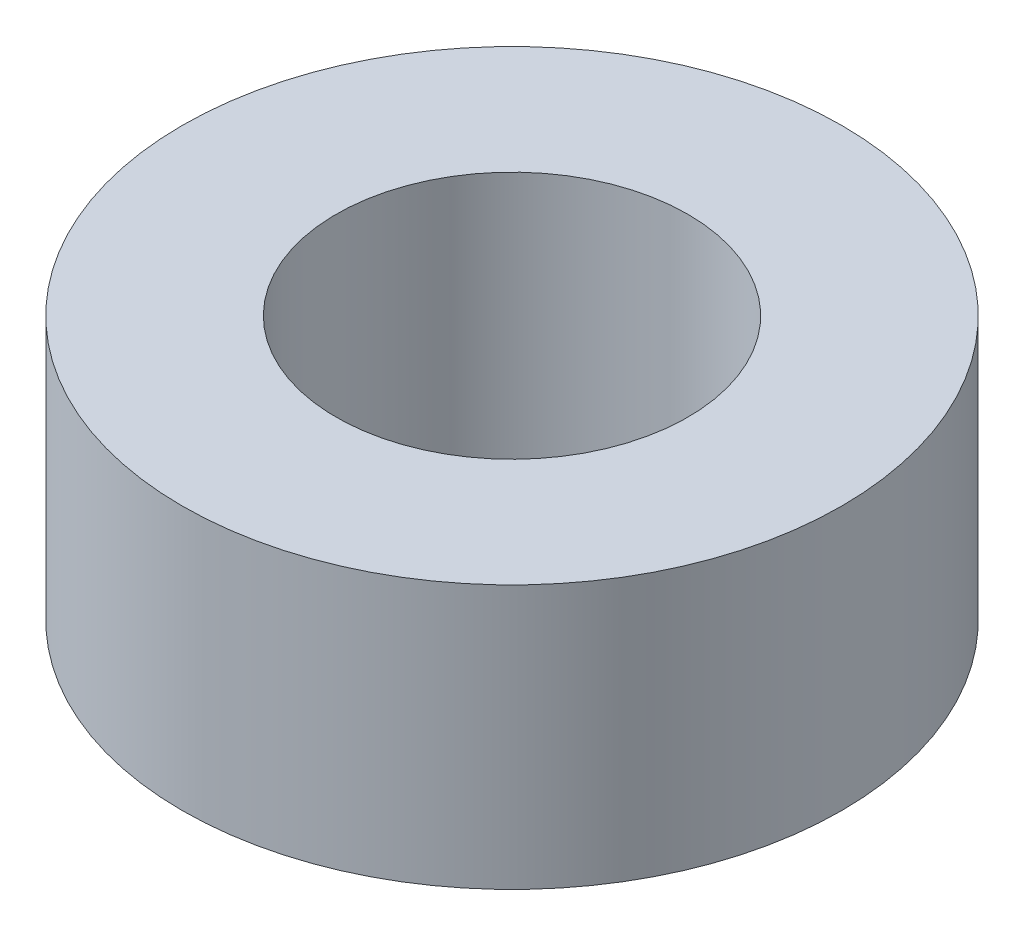
ISO-10303-21;
HEADER;
FILE_DESCRIPTION(('STEP AP214'),'2;1');
FILE_NAME('part.step','',(''),(''),'','','');
FILE_SCHEMA(('AUTOMOTIVE_DESIGN { 1 0 10303 214 1 1 1 1 }'));
ENDSEC;
DATA;
#1=APPLICATION_CONTEXT('core data for automotive mechanical design processes');
#2=APPLICATION_PROTOCOL_DEFINITION('international standard','automotive_design',2000,#1);
#3=PRODUCT_CONTEXT('',#1,'mechanical');
#4=PRODUCT('Part','Part','',(#3));
#5=PRODUCT_RELATED_PRODUCT_CATEGORY('part','',(#4));
#6=PRODUCT_DEFINITION_FORMATION('','',#4);
#7=PRODUCT_DEFINITION_CONTEXT('part definition',#1,'design');
#8=PRODUCT_DEFINITION('design','',#6,#7);
#9=PRODUCT_DEFINITION_SHAPE('','',#8);
#10=(LENGTH_UNIT() NAMED_UNIT(*) SI_UNIT(.MILLI.,.METRE.));
#11=(NAMED_UNIT(*) PLANE_ANGLE_UNIT() SI_UNIT($,.RADIAN.));
#12=(NAMED_UNIT(*) SI_UNIT($,.STERADIAN.) SOLID_ANGLE_UNIT());
#13=UNCERTAINTY_MEASURE_WITH_UNIT(LENGTH_MEASURE(1.E-05),#10,'distance_accuracy_value','');
#14=(GEOMETRIC_REPRESENTATION_CONTEXT(3) GLOBAL_UNCERTAINTY_ASSIGNED_CONTEXT((#13)) GLOBAL_UNIT_ASSIGNED_CONTEXT((#10,
#11,#12)) REPRESENTATION_CONTEXT('',''));
#15=CARTESIAN_POINT('',(0.,0.,0.));
#16=DIRECTION('',(0.,0.,1.));
#17=DIRECTION('',(1.,0.,0.));
#18=AXIS2_PLACEMENT_3D('',#15,#16,#17);
#19=CARTESIAN_POINT('',(0.,9.525,0.));
#20=DIRECTION('',(0.,1.,0.));
#21=DIRECTION('',(0.,0.,1.));
#22=AXIS2_PLACEMENT_3D('',#19,#20,#21);
#23=PLANE('',#22);
#24=CARTESIAN_POINT('',(0.,9.525,0.));
#25=DIRECTION('',(0.,1.,0.));
#26=DIRECTION('',(0.,0.,1.));
#27=AXIS2_PLACEMENT_3D('',#24,#25,#26);
#28=CIRCLE('',#27,11.90625);
#29=CARTESIAN_POINT('',(0.,9.525,-11.90625));
#30=VERTEX_POINT('',#29);
#31=EDGE_CURVE('E10',#30,#30,#28,.T.);
#32=ORIENTED_EDGE('',*,*,#31,.T.);
#33=EDGE_LOOP('',(#32));
#34=FACE_BOUND('',#33,.T.);
#35=CARTESIAN_POINT('',(0.,9.525,0.));
#36=DIRECTION('',(0.,1.,0.));
#37=DIRECTION('',(0.,0.,1.));
#38=AXIS2_PLACEMENT_3D('',#35,#36,#37);
#39=CIRCLE('',#38,6.35);
#40=CARTESIAN_POINT('',(0.,9.525,-6.35));
#41=VERTEX_POINT('',#40);
#42=EDGE_CURVE('E44',#41,#41,#39,.T.);
#43=ORIENTED_EDGE('',*,*,#42,.F.);
#44=EDGE_LOOP('',(#43));
#45=FACE_BOUND('',#44,.T.);
#46=ADVANCED_FACE('F33',(#34,#45),#23,.T.);
#47=CARTESIAN_POINT('',(0.,0.,0.));
#48=DIRECTION('',(0.,1.,0.));
#49=DIRECTION('',(0.,0.,1.));
#50=AXIS2_PLACEMENT_3D('',#47,#48,#49);
#51=PLANE('',#50);
#52=CARTESIAN_POINT('',(0.,0.,0.));
#53=DIRECTION('',(0.,1.,0.));
#54=DIRECTION('',(0.,0.,1.));
#55=AXIS2_PLACEMENT_3D('',#52,#53,#54);
#56=CIRCLE('',#55,11.90625);
#57=CARTESIAN_POINT('',(0.,0.,-11.90625));
#58=VERTEX_POINT('',#57);
#59=EDGE_CURVE('E37',#58,#58,#56,.T.);
#60=ORIENTED_EDGE('',*,*,#59,.F.);
#61=EDGE_LOOP('',(#60));
#62=FACE_BOUND('',#61,.T.);
#63=CARTESIAN_POINT('',(0.,0.,0.));
#64=DIRECTION('',(0.,1.,0.));
#65=DIRECTION('',(0.,0.,1.));
#66=AXIS2_PLACEMENT_3D('',#63,#64,#65);
#67=CIRCLE('',#66,6.35);
#68=CARTESIAN_POINT('',(0.,0.,-6.35));
#69=VERTEX_POINT('',#68);
#70=EDGE_CURVE('E46',#69,#69,#67,.T.);
#71=ORIENTED_EDGE('',*,*,#70,.T.);
#72=EDGE_LOOP('',(#71));
#73=FACE_BOUND('',#72,.T.);
#74=ADVANCED_FACE('F56',(#62,#73),#51,.F.);
#75=CARTESIAN_POINT('',(0.,9.525,0.));
#76=DIRECTION('',(0.,-1.,0.));
#77=DIRECTION('',(0.,0.,-1.));
#78=AXIS2_PLACEMENT_3D('',#75,#76,#77);
#79=CYLINDRICAL_SURFACE('',#78,11.90625);
#80=CARTESIAN_POINT('',(0.,9.525,-11.90625));
#81=CARTESIAN_POINT('',(0.,9.42578125,-11.90625));
#82=CARTESIAN_POINT('',(0.,9.3265625,-11.90625));
#83=CARTESIAN_POINT('',(0.,9.128125,-11.90625));
#84=CARTESIAN_POINT('',(0.,9.02890625,-11.90625));
#85=CARTESIAN_POINT('',(0.,8.83046875,-11.90625));
#86=CARTESIAN_POINT('',(0.,8.73125,-11.90625));
#87=CARTESIAN_POINT('',(0.,8.5328125,-11.90625));
#88=CARTESIAN_POINT('',(0.,8.43359375,-11.90625));
#89=CARTESIAN_POINT('',(0.,8.23515625,-11.90625));
#90=CARTESIAN_POINT('',(0.,8.1359375,-11.90625));
#91=CARTESIAN_POINT('',(0.,7.9375,-11.90625));
#92=CARTESIAN_POINT('',(0.,7.83828125,-11.90625));
#93=CARTESIAN_POINT('',(0.,7.63984375,-11.90625));
#94=CARTESIAN_POINT('',(0.,7.540625,-11.90625));
#95=CARTESIAN_POINT('',(0.,7.3421875,-11.90625));
#96=CARTESIAN_POINT('',(0.,7.24296875,-11.90625));
#97=CARTESIAN_POINT('',(0.,7.04453125,-11.90625));
#98=CARTESIAN_POINT('',(0.,6.9453125,-11.90625));
#99=CARTESIAN_POINT('',(0.,6.746875,-11.90625));
#100=CARTESIAN_POINT('',(0.,6.64765625,-11.90625));
#101=CARTESIAN_POINT('',(0.,6.44921875,-11.90625));
#102=CARTESIAN_POINT('',(0.,6.35,-11.90625));
#103=CARTESIAN_POINT('',(0.,6.1515625,-11.90625));
#104=CARTESIAN_POINT('',(0.,6.05234375,-11.90625));
#105=CARTESIAN_POINT('',(0.,5.85390625,-11.90625));
#106=CARTESIAN_POINT('',(0.,5.7546875,-11.90625));
#107=CARTESIAN_POINT('',(0.,5.55625,-11.90625));
#108=CARTESIAN_POINT('',(0.,5.45703125,-11.90625));
#109=CARTESIAN_POINT('',(0.,5.25859375,-11.90625));
#110=CARTESIAN_POINT('',(0.,5.159375,-11.90625));
#111=CARTESIAN_POINT('',(0.,4.9609375,-11.90625));
#112=CARTESIAN_POINT('',(0.,4.86171875,-11.90625));
#113=CARTESIAN_POINT('',(0.,4.66328125,-11.90625));
#114=CARTESIAN_POINT('',(0.,4.5640625,-11.90625));
#115=CARTESIAN_POINT('',(0.,4.365625,-11.90625));
#116=CARTESIAN_POINT('',(0.,4.26640625,-11.90625));
#117=CARTESIAN_POINT('',(0.,4.06796875,-11.90625));
#118=CARTESIAN_POINT('',(0.,3.96875,-11.90625));
#119=CARTESIAN_POINT('',(0.,3.7703125,-11.90625));
#120=CARTESIAN_POINT('',(0.,3.67109375,-11.90625));
#121=CARTESIAN_POINT('',(0.,3.47265625,-11.90625));
#122=CARTESIAN_POINT('',(0.,3.3734375,-11.90625));
#123=CARTESIAN_POINT('',(0.,3.175,-11.90625));
#124=CARTESIAN_POINT('',(0.,3.07578125,-11.90625));
#125=CARTESIAN_POINT('',(0.,2.87734375,-11.90625));
#126=CARTESIAN_POINT('',(0.,2.778125,-11.90625));
#127=CARTESIAN_POINT('',(0.,2.5796875,-11.90625));
#128=CARTESIAN_POINT('',(0.,2.48046875,-11.90625));
#129=CARTESIAN_POINT('',(0.,2.28203125,-11.90625));
#130=CARTESIAN_POINT('',(0.,2.1828125,-11.90625));
#131=CARTESIAN_POINT('',(0.,1.984375,-11.90625));
#132=CARTESIAN_POINT('',(0.,1.88515625,-11.90625));
#133=CARTESIAN_POINT('',(0.,1.68671875,-11.90625));
#134=CARTESIAN_POINT('',(0.,1.5875,-11.90625));
#135=CARTESIAN_POINT('',(0.,1.3890625,-11.90625));
#136=CARTESIAN_POINT('',(0.,1.28984375,-11.90625));
#137=CARTESIAN_POINT('',(0.,1.09140625,-11.90625));
#138=CARTESIAN_POINT('',(0.,0.992187500000001,-11.90625));
#139=CARTESIAN_POINT('',(0.,0.793750000000001,-11.90625));
#140=CARTESIAN_POINT('',(0.,0.69453125,-11.90625));
#141=CARTESIAN_POINT('',(0.,0.49609375,-11.90625));
#142=CARTESIAN_POINT('',(0.,0.396875,-11.90625));
#143=CARTESIAN_POINT('',(0.,0.1984375,-11.90625));
#144=CARTESIAN_POINT('',(0.,0.0992187500000001,-11.90625));
#145=CARTESIAN_POINT('',(0.,0.,-11.90625));
#146=B_SPLINE_CURVE_WITH_KNOTS('',3,(#80,#81,#82,#83,#84,#85,#86,#87,#88,#89,#90,#91,#92,#93,
#94,#95,#96,#97,#98,#99,#100,#101,#102,#103,#104,#105,#106,#107,#108,#109,#110,#111,#112,#113,
#114,#115,#116,#117,#118,#119,#120,#121,#122,#123,#124,#125,#126,#127,#128,#129,#130,#131,#132,
#133,#134,#135,#136,#137,#138,#139,#140,#141,#142,#143,#144,#145),.UNSPECIFIED.,.F.,.F.,(4,2,2,
2,2,2,2,2,2,2,2,2,2,2,2,2,2,2,2,2,2,2,2,2,2,2,2,2,2,2,2,2,4),(0.,0.29765625,0.5953125,
0.892968750000001,1.190625,1.48828125,1.7859375,2.08359375,2.38125,2.67890625,2.9765625,
3.27421875,3.571875,3.86953125,4.1671875,4.46484375,4.7625,5.06015625,5.3578125,5.65546875,
5.953125,6.25078125,6.5484375,6.84609375,7.14375,7.44140625,7.7390625,8.03671875,8.334375,
8.63203125,8.9296875,9.22734375,9.525),.UNSPECIFIED.);
#147=EDGE_CURVE('BSEAM35',#30,#58,#146,.T.);
#148=ORIENTED_EDGE('',*,*,#31,.F.);
#149=ORIENTED_EDGE('',*,*,#59,.T.);
#150=ORIENTED_EDGE('',*,*,#147,.T.);
#151=ORIENTED_EDGE('',*,*,#147,.F.);
#152=EDGE_LOOP('',(#148,#150,#149,#151));
#153=FACE_BOUND('',#152,.T.);
#154=ADVANCED_FACE('F35',(#153),#79,.T.);
#155=CARTESIAN_POINT('',(0.,9.525,0.));
#156=DIRECTION('',(0.,-1.,0.));
#157=DIRECTION('',(0.,0.,-1.));
#158=AXIS2_PLACEMENT_3D('',#155,#156,#157);
#159=CYLINDRICAL_SURFACE('',#158,6.35);
#160=CARTESIAN_POINT('',(0.,9.525,-6.35));
#161=CARTESIAN_POINT('',(0.,9.42578125,-6.35));
#162=CARTESIAN_POINT('',(0.,9.3265625,-6.35));
#163=CARTESIAN_POINT('',(0.,9.128125,-6.35));
#164=CARTESIAN_POINT('',(0.,9.02890625,-6.35));
#165=CARTESIAN_POINT('',(0.,8.83046875,-6.35));
#166=CARTESIAN_POINT('',(0.,8.73125,-6.35));
#167=CARTESIAN_POINT('',(0.,8.5328125,-6.35));
#168=CARTESIAN_POINT('',(0.,8.43359375,-6.35));
#169=CARTESIAN_POINT('',(0.,8.23515625,-6.35));
#170=CARTESIAN_POINT('',(0.,8.1359375,-6.35));
#171=CARTESIAN_POINT('',(0.,7.9375,-6.35));
#172=CARTESIAN_POINT('',(0.,7.83828125,-6.35));
#173=CARTESIAN_POINT('',(0.,7.63984375,-6.35));
#174=CARTESIAN_POINT('',(0.,7.540625,-6.35));
#175=CARTESIAN_POINT('',(0.,7.3421875,-6.35));
#176=CARTESIAN_POINT('',(0.,7.24296875,-6.35));
#177=CARTESIAN_POINT('',(0.,7.04453125,-6.35));
#178=CARTESIAN_POINT('',(0.,6.9453125,-6.35));
#179=CARTESIAN_POINT('',(0.,6.746875,-6.35));
#180=CARTESIAN_POINT('',(0.,6.64765625,-6.35));
#181=CARTESIAN_POINT('',(0.,6.44921875,-6.35));
#182=CARTESIAN_POINT('',(0.,6.35,-6.35));
#183=CARTESIAN_POINT('',(0.,6.1515625,-6.35));
#184=CARTESIAN_POINT('',(0.,6.05234375,-6.35));
#185=CARTESIAN_POINT('',(0.,5.85390625,-6.35));
#186=CARTESIAN_POINT('',(0.,5.7546875,-6.35));
#187=CARTESIAN_POINT('',(0.,5.55625,-6.35));
#188=CARTESIAN_POINT('',(0.,5.45703125,-6.35));
#189=CARTESIAN_POINT('',(0.,5.25859375,-6.35));
#190=CARTESIAN_POINT('',(0.,5.159375,-6.35));
#191=CARTESIAN_POINT('',(0.,4.9609375,-6.35));
#192=CARTESIAN_POINT('',(0.,4.86171875,-6.35));
#193=CARTESIAN_POINT('',(0.,4.66328125,-6.35));
#194=CARTESIAN_POINT('',(0.,4.5640625,-6.35));
#195=CARTESIAN_POINT('',(0.,4.365625,-6.35));
#196=CARTESIAN_POINT('',(0.,4.26640625,-6.35));
#197=CARTESIAN_POINT('',(0.,4.06796875,-6.35));
#198=CARTESIAN_POINT('',(0.,3.96875,-6.35));
#199=CARTESIAN_POINT('',(0.,3.7703125,-6.35));
#200=CARTESIAN_POINT('',(0.,3.67109375,-6.35));
#201=CARTESIAN_POINT('',(0.,3.47265625,-6.35));
#202=CARTESIAN_POINT('',(0.,3.3734375,-6.35));
#203=CARTESIAN_POINT('',(0.,3.175,-6.35));
#204=CARTESIAN_POINT('',(0.,3.07578125,-6.35));
#205=CARTESIAN_POINT('',(0.,2.87734375,-6.35));
#206=CARTESIAN_POINT('',(0.,2.778125,-6.35));
#207=CARTESIAN_POINT('',(0.,2.5796875,-6.35));
#208=CARTESIAN_POINT('',(0.,2.48046875,-6.35));
#209=CARTESIAN_POINT('',(0.,2.28203125,-6.35));
#210=CARTESIAN_POINT('',(0.,2.1828125,-6.35));
#211=CARTESIAN_POINT('',(0.,1.984375,-6.35));
#212=CARTESIAN_POINT('',(0.,1.88515625,-6.35));
#213=CARTESIAN_POINT('',(0.,1.68671875,-6.35));
#214=CARTESIAN_POINT('',(0.,1.5875,-6.35));
#215=CARTESIAN_POINT('',(0.,1.3890625,-6.35));
#216=CARTESIAN_POINT('',(0.,1.28984375,-6.35));
#217=CARTESIAN_POINT('',(0.,1.09140625,-6.35));
#218=CARTESIAN_POINT('',(0.,0.992187500000001,-6.35));
#219=CARTESIAN_POINT('',(0.,0.793750000000001,-6.35));
#220=CARTESIAN_POINT('',(0.,0.69453125,-6.35));
#221=CARTESIAN_POINT('',(0.,0.49609375,-6.35));
#222=CARTESIAN_POINT('',(0.,0.396875,-6.35));
#223=CARTESIAN_POINT('',(0.,0.1984375,-6.35));
#224=CARTESIAN_POINT('',(0.,0.0992187500000001,-6.35));
#225=CARTESIAN_POINT('',(0.,0.,-6.35));
#226=B_SPLINE_CURVE_WITH_KNOTS('',3,(#160,#161,#162,#163,#164,#165,#166,#167,#168,#169,#170,
#171,#172,#173,#174,#175,#176,#177,#178,#179,#180,#181,#182,#183,#184,#185,#186,#187,#188,#189,
#190,#191,#192,#193,#194,#195,#196,#197,#198,#199,#200,#201,#202,#203,#204,#205,#206,#207,#208,
#209,#210,#211,#212,#213,#214,#215,#216,#217,#218,#219,#220,#221,#222,#223,#224,#225),
.UNSPECIFIED.,.F.,.F.,(4,2,2,2,2,2,2,2,2,2,2,2,2,2,2,2,2,2,2,2,2,2,2,2,2,2,2,2,2,2,2,2,4),(0.,
0.297656249999998,0.595312499999999,0.892968749999999,1.190625,1.48828125,1.7859375,2.08359375,
2.38125,2.67890625,2.9765625,3.27421875,3.571875,3.86953125,4.1671875,4.46484375,4.7625,
5.06015625,5.3578125,5.65546875,5.953125,6.25078125,6.5484375,6.84609375,7.14375,7.44140625,
7.7390625,8.03671875,8.334375,8.63203125,8.9296875,9.22734375,9.525),.UNSPECIFIED.);
#227=EDGE_CURVE('BSEAM52',#41,#69,#226,.T.);
#228=ORIENTED_EDGE('',*,*,#42,.T.);
#229=ORIENTED_EDGE('',*,*,#70,.F.);
#230=ORIENTED_EDGE('',*,*,#227,.T.);
#231=ORIENTED_EDGE('',*,*,#227,.F.);
#232=EDGE_LOOP('',(#228,#230,#229,#231));
#233=FACE_BOUND('',#232,.T.);
#234=ADVANCED_FACE('F52',(#233),#159,.F.);
#235=CLOSED_SHELL('',(#46,#74,#154,#234));
#236=MANIFOLD_SOLID_BREP('B2',#235);
#237=ADVANCED_BREP_SHAPE_REPRESENTATION('',(#18,#236),#14);
#238=SHAPE_DEFINITION_REPRESENTATION(#9,#237);
ENDSEC;
END-ISO-10303-21;
